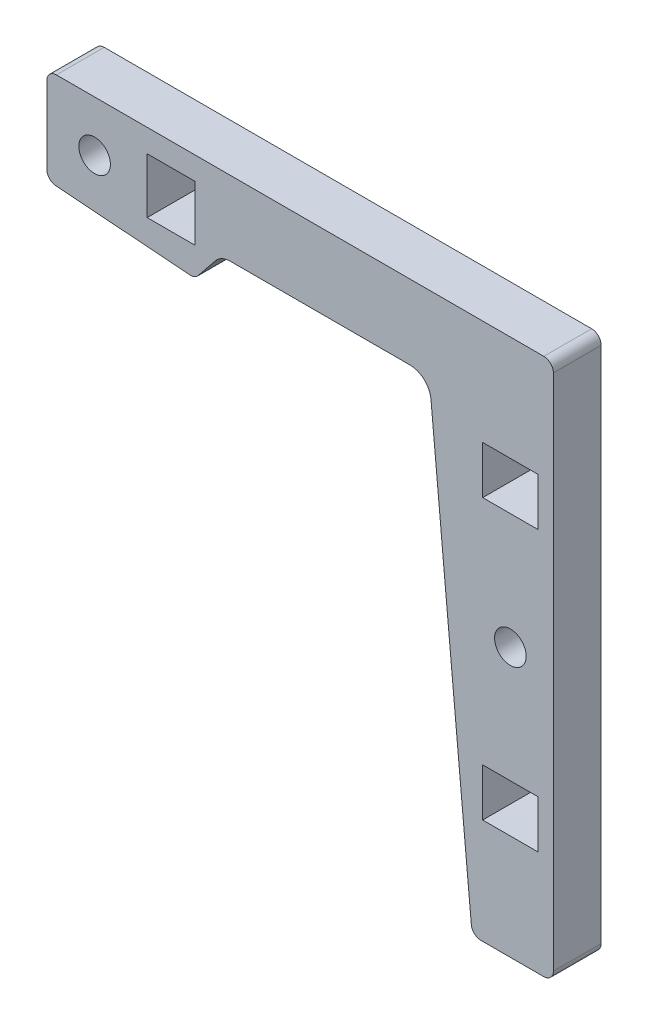
ISO-10303-21;
HEADER;
FILE_DESCRIPTION(('STEP AP214'),'2;1');
FILE_NAME('part.step','',(''),(''),'','','');
FILE_SCHEMA(('AUTOMOTIVE_DESIGN { 1 0 10303 214 1 1 1 1 }'));
ENDSEC;
DATA;
#1=APPLICATION_CONTEXT('core data for automotive mechanical design processes');
#2=APPLICATION_PROTOCOL_DEFINITION('international standard','automotive_design',2000,#1);
#3=PRODUCT_CONTEXT('',#1,'mechanical');
#4=PRODUCT('Part','Part','',(#3));
#5=PRODUCT_RELATED_PRODUCT_CATEGORY('part','',(#4));
#6=PRODUCT_DEFINITION_FORMATION('','',#4);
#7=PRODUCT_DEFINITION_CONTEXT('part definition',#1,'design');
#8=PRODUCT_DEFINITION('design','',#6,#7);
#9=PRODUCT_DEFINITION_SHAPE('','',#8);
#10=(LENGTH_UNIT() NAMED_UNIT(*) SI_UNIT(.MILLI.,.METRE.));
#11=(NAMED_UNIT(*) PLANE_ANGLE_UNIT() SI_UNIT($,.RADIAN.));
#12=(NAMED_UNIT(*) SI_UNIT($,.STERADIAN.) SOLID_ANGLE_UNIT());
#13=UNCERTAINTY_MEASURE_WITH_UNIT(LENGTH_MEASURE(1.E-05),#10,'distance_accuracy_value','');
#14=(GEOMETRIC_REPRESENTATION_CONTEXT(3) GLOBAL_UNCERTAINTY_ASSIGNED_CONTEXT((#13)) GLOBAL_UNIT_ASSIGNED_CONTEXT((#10,
#11,#12)) REPRESENTATION_CONTEXT('',''));
#15=CARTESIAN_POINT('',(0.,0.,0.));
#16=DIRECTION('',(0.,0.,1.));
#17=DIRECTION('',(1.,0.,0.));
#18=AXIS2_PLACEMENT_3D('',#15,#16,#17);
#19=CARTESIAN_POINT('',(699.262,25.6699999680005,79.314999993));
#20=DIRECTION('',(0.,0.,-1.));
#21=DIRECTION('',(-1.,0.,0.));
#22=AXIS2_PLACEMENT_3D('',#19,#20,#21);
#23=PLANE('',#22);
#24=DIRECTION('',(0.,1.,0.));
#25=VECTOR('',#24,1.);
#26=CARTESIAN_POINT('',(740.160750815999,24.13,79.314999993));
#27=LINE('',#26,#25);
#28=CARTESIAN_POINT('',(740.160750815999,17.7799999999999,79.314999993));
#29=VERTEX_POINT('',#28);
#30=CARTESIAN_POINT('',(740.160750815999,24.13,79.314999993));
#31=VERTEX_POINT('',#30);
#32=EDGE_CURVE('E264',#29,#31,#27,.T.);
#33=ORIENTED_EDGE('',*,*,#32,.F.);
#34=DIRECTION('',(1.,0.,0.));
#35=VECTOR('',#34,1.);
#36=CARTESIAN_POINT('',(732.810750783999,17.7799999999999,79.314999993));
#37=LINE('',#36,#35);
#38=CARTESIAN_POINT('',(732.810750783999,17.7799999999999,79.314999993));
#39=VERTEX_POINT('',#38);
#40=EDGE_CURVE('E272',#39,#29,#37,.T.);
#41=ORIENTED_EDGE('',*,*,#40,.F.);
#42=DIRECTION('',(0.,-1.,0.));
#43=VECTOR('',#42,1.);
#44=CARTESIAN_POINT('',(732.810750783999,24.13,79.314999993));
#45=LINE('',#44,#43);
#46=CARTESIAN_POINT('',(732.810750783999,24.13,79.314999993));
#47=VERTEX_POINT('',#46);
#48=EDGE_CURVE('E269',#47,#39,#45,.T.);
#49=ORIENTED_EDGE('',*,*,#48,.F.);
#50=DIRECTION('',(-1.,0.,0.));
#51=VECTOR('',#50,1.);
#52=CARTESIAN_POINT('',(732.810750783999,24.13,79.314999993));
#53=LINE('',#52,#51);
#54=EDGE_CURVE('E266',#31,#47,#53,.T.);
#55=ORIENTED_EDGE('',*,*,#54,.F.);
#56=EDGE_LOOP('',(#33,#41,#49,#55));
#57=FACE_BOUND('',#56,.T.);
#58=CARTESIAN_POINT('',(681.2407508,31.3849999680003,79.314999993));
#59=DIRECTION('',(0.,0.,1.));
#60=DIRECTION('',(1.,0.,0.));
#61=AXIS2_PLACEMENT_3D('',#58,#59,#60);
#62=CIRCLE('',#61,2.099999991);
#63=CARTESIAN_POINT('',(683.340750791,31.3849999680003,79.314999993));
#64=VERTEX_POINT('',#63);
#65=EDGE_CURVE('E332',#64,#64,#62,.T.);
#66=ORIENTED_EDGE('',*,*,#65,.F.);
#67=EDGE_LOOP('',(#66));
#68=FACE_BOUND('',#67,.T.);
#69=DIRECTION('',(1.,0.,0.));
#70=VECTOR('',#69,1.);
#71=CARTESIAN_POINT('',(731.405750799999,-33.2899999679999,79.314999993));
#72=LINE('',#71,#70);
#73=CARTESIAN_POINT('',(732.563295383125,-33.2899999679999,79.314999993));
#74=VERTEX_POINT('',#73);
#75=CARTESIAN_POINT('',(740.930750799999,-33.2899999679999,79.314999993));
#76=VERTEX_POINT('',#75);
#77=EDGE_CURVE('E357',#74,#76,#72,.T.);
#78=ORIENTED_EDGE('',*,*,#77,.T.);
#79=CARTESIAN_POINT('',(740.930750799999,-32.0199999679999,79.314999993));
#80=DIRECTION('',(0.,0.,-1.));
#81=DIRECTION('',(-1.,0.,0.));
#82=AXIS2_PLACEMENT_3D('',#79,#80,#81);
#83=CIRCLE('',#82,1.27);
#84=CARTESIAN_POINT('',(742.200750799999,-32.0199999679999,79.314999993));
#85=VERTEX_POINT('',#84);
#86=EDGE_CURVE('E429',#76,#85,#83,.F.);
#87=ORIENTED_EDGE('',*,*,#86,.T.);
#88=DIRECTION('',(0.,1.,0.));
#89=VECTOR('',#88,1.);
#90=CARTESIAN_POINT('',(742.200750799999,-33.2899999679999,79.314999993));
#91=LINE('',#90,#89);
#92=CARTESIAN_POINT('',(742.200750799999,36.83,79.314999993));
#93=VERTEX_POINT('',#92);
#94=EDGE_CURVE('E360',#85,#93,#91,.T.);
#95=ORIENTED_EDGE('',*,*,#94,.T.);
#96=CARTESIAN_POINT('',(740.930750799999,36.83,79.314999993));
#97=DIRECTION('',(0.,0.,-1.));
#98=DIRECTION('',(-1.,0.,0.));
#99=AXIS2_PLACEMENT_3D('',#96,#97,#98);
#100=CIRCLE('',#99,1.27);
#101=CARTESIAN_POINT('',(740.930750799999,38.1,79.314999993));
#102=VERTEX_POINT('',#101);
#103=EDGE_CURVE('E427',#93,#102,#100,.F.);
#104=ORIENTED_EDGE('',*,*,#103,.T.);
#105=DIRECTION('',(-1.,0.,0.));
#106=VECTOR('',#105,1.);
#107=CARTESIAN_POINT('',(742.200750799999,38.1,79.314999993));
#108=LINE('',#107,#106);
#109=CARTESIAN_POINT('',(676.1607508,38.1,79.314999993));
#110=VERTEX_POINT('',#109);
#111=EDGE_CURVE('E338',#102,#110,#108,.T.);
#112=ORIENTED_EDGE('',*,*,#111,.T.);
#113=CARTESIAN_POINT('',(676.1607508,36.83,79.314999993));
#114=DIRECTION('',(0.,0.,-1.));
#115=DIRECTION('',(-1.,0.,0.));
#116=AXIS2_PLACEMENT_3D('',#113,#114,#115);
#117=CIRCLE('',#116,1.27);
#118=CARTESIAN_POINT('',(674.8907508,36.83,79.314999993));
#119=VERTEX_POINT('',#118);
#120=EDGE_CURVE('E425',#110,#119,#117,.F.);
#121=ORIENTED_EDGE('',*,*,#120,.T.);
#122=DIRECTION('',(0.,-1.,0.));
#123=VECTOR('',#122,1.);
#124=CARTESIAN_POINT('',(674.8907508,38.1,79.314999993));
#125=LINE('',#124,#123);
#126=CARTESIAN_POINT('',(674.8907508,26.5769075709626,79.314999993));
#127=VERTEX_POINT('',#126);
#128=EDGE_CURVE('E341',#119,#127,#125,.T.);
#129=ORIENTED_EDGE('',*,*,#128,.T.);
#130=CARTESIAN_POINT('',(676.1607508,26.5769075709626,79.314999993));
#131=DIRECTION('',(0.,0.,-1.));
#132=DIRECTION('',(-1.,0.,0.));
#133=AXIS2_PLACEMENT_3D('',#130,#131,#132);
#134=CIRCLE('',#133,1.27);
#135=CARTESIAN_POINT('',(676.064256343641,25.3105786958705,79.314999993));
#136=VERTEX_POINT('',#135);
#137=EDGE_CURVE('E421',#127,#136,#134,.F.);
#138=ORIENTED_EDGE('',*,*,#137,.T.);
#139=DIRECTION('',(0.997109350466224,-0.0759798868966348,0.));
#140=VECTOR('',#139,1.);
#141=CARTESIAN_POINT('',(674.8907508,25.4,79.314999993));
#142=LINE('',#141,#140);
#143=CARTESIAN_POINT('',(693.909268652957,23.9507859948022,79.314999993));
#144=VERTEX_POINT('',#143);
#145=EDGE_CURVE('E345',#136,#144,#142,.T.);
#146=ORIENTED_EDGE('',*,*,#145,.T.);
#147=CARTESIAN_POINT('',(694.005763109316,25.2171148698943,79.314999993));
#148=DIRECTION('',(0.,0.,-1.));
#149=DIRECTION('',(-1.,0.,0.));
#150=AXIS2_PLACEMENT_3D('',#147,#148,#149);
#151=CIRCLE('',#150,1.27);
#152=CARTESIAN_POINT('',(694.994953697404,24.4206213166005,79.314999993));
#153=VERTEX_POINT('',#152);
#154=EDGE_CURVE('E57',#144,#153,#151,.F.);
#155=ORIENTED_EDGE('',*,*,#154,.T.);
#156=DIRECTION('',(0.627160278184119,0.77889022684074,0.));
#157=VECTOR('',#156,1.);
#158=CARTESIAN_POINT('',(694.5757508,23.8999999520003,79.314999993));
#159=LINE('',#158,#157);
#160=CARTESIAN_POINT('',(697.283618823825,27.2629870745882,79.314999993));
#161=VERTEX_POINT('',#160);
#162=EDGE_CURVE('E347',#153,#161,#159,.T.);
#163=ORIENTED_EDGE('',*,*,#162,.T.);
#164=CARTESIAN_POINT('',(699.262,25.6699999680005,79.314999993));
#165=DIRECTION('',(0.,0.,-1.));
#166=DIRECTION('',(-1.,0.,0.));
#167=AXIS2_PLACEMENT_3D('',#164,#165,#166);
#168=CIRCLE('',#167,2.53999999999999);
#169=CARTESIAN_POINT('',(699.262,28.2099999680004,79.314999993));
#170=VERTEX_POINT('',#169);
#171=EDGE_CURVE('E349',#161,#170,#168,.T.);
#172=ORIENTED_EDGE('',*,*,#171,.T.);
#173=DIRECTION('',(1.,0.,0.));
#174=VECTOR('',#173,1.);
#175=CARTESIAN_POINT('',(699.262,28.2099999680005,79.314999993));
#176=LINE('',#175,#174);
#177=CARTESIAN_POINT('',(723.138,28.2099999680005,79.314999993));
#178=VERTEX_POINT('',#177);
#179=EDGE_CURVE('E351',#170,#178,#176,.T.);
#180=ORIENTED_EDGE('',*,*,#179,.T.);
#181=CARTESIAN_POINT('',(723.138,25.4039824240846,79.314999993));
#182=DIRECTION('',(0.,0.,-1.));
#183=DIRECTION('',(1.,0.,0.));
#184=AXIS2_PLACEMENT_3D('',#181,#182,#183);
#185=CIRCLE('',#184,2.80601754391578);
#186=CARTESIAN_POINT('',(725.932,25.6634018851243,79.314999993));
#187=VERTEX_POINT('',#186);
#188=EDGE_CURVE('E353',#178,#187,#185,.T.);
#189=ORIENTED_EDGE('',*,*,#188,.T.);
#190=DIRECTION('',(0.0924511187045921,-0.995717224241034,0.));
#191=VECTOR('',#190,1.);
#192=CARTESIAN_POINT('',(725.932,25.6634018851243,79.314999993));
#193=LINE('',#192,#191);
#194=CARTESIAN_POINT('',(731.298734508339,-32.1374128887547,79.314999993));
#195=VERTEX_POINT('',#194);
#196=EDGE_CURVE('E355',#187,#195,#193,.T.);
#197=ORIENTED_EDGE('',*,*,#196,.T.);
#198=CARTESIAN_POINT('',(732.563295383125,-32.0199999679999,79.314999993));
#199=DIRECTION('',(0.,0.,-1.));
#200=DIRECTION('',(-1.,0.,0.));
#201=AXIS2_PLACEMENT_3D('',#198,#199,#200);
#202=CIRCLE('',#201,1.27);
#203=EDGE_CURVE('E423',#195,#74,#202,.F.);
#204=ORIENTED_EDGE('',*,*,#203,.T.);
#205=EDGE_LOOP('',(#78,#87,#95,#104,#112,#121,#129,#138,#146,#155,#163,#172,#180,#189,#197,#204));
#206=FACE_BOUND('',#205,.T.);
#207=DIRECTION('',(0.,1.,0.));
#208=VECTOR('',#207,1.);
#209=CARTESIAN_POINT('',(694.5757508,35.0599999840003,79.314999993));
#210=LINE('',#209,#208);
#211=CARTESIAN_POINT('',(694.5757508,27.7099999520003,79.314999993));
#212=VERTEX_POINT('',#211);
#213=CARTESIAN_POINT('',(694.5757508,35.0599999840003,79.314999993));
#214=VERTEX_POINT('',#213);
#215=EDGE_CURVE('E301',#212,#214,#210,.T.);
#216=ORIENTED_EDGE('',*,*,#215,.F.);
#217=DIRECTION('',(1.,0.,0.));
#218=VECTOR('',#217,1.);
#219=CARTESIAN_POINT('',(688.2257508,27.7099999520003,79.314999993));
#220=LINE('',#219,#218);
#221=CARTESIAN_POINT('',(688.2257508,27.7099999520003,79.314999993));
#222=VERTEX_POINT('',#221);
#223=EDGE_CURVE('E309',#222,#212,#220,.T.);
#224=ORIENTED_EDGE('',*,*,#223,.F.);
#225=DIRECTION('',(0.,-1.,0.));
#226=VECTOR('',#225,1.);
#227=CARTESIAN_POINT('',(688.2257508,35.0599999840003,79.314999993));
#228=LINE('',#227,#226);
#229=CARTESIAN_POINT('',(688.2257508,35.0599999840003,79.314999993));
#230=VERTEX_POINT('',#229);
#231=EDGE_CURVE('E306',#230,#222,#228,.T.);
#232=ORIENTED_EDGE('',*,*,#231,.F.);
#233=DIRECTION('',(-1.,0.,0.));
#234=VECTOR('',#233,1.);
#235=CARTESIAN_POINT('',(688.2257508,35.0599999840003,79.314999993));
#236=LINE('',#235,#234);
#237=EDGE_CURVE('E303',#214,#230,#236,.T.);
#238=ORIENTED_EDGE('',*,*,#237,.F.);
#239=EDGE_LOOP('',(#216,#224,#232,#238));
#240=FACE_BOUND('',#239,.T.);
#241=CARTESIAN_POINT('',(736.485750799999,2.40500001600005,79.314999993));
#242=DIRECTION('',(0.,0.,1.));
#243=DIRECTION('',(1.,0.,0.));
#244=AXIS2_PLACEMENT_3D('',#241,#242,#243);
#245=CIRCLE('',#244,2.099999991);
#246=CARTESIAN_POINT('',(738.585750790999,2.40500001600005,79.314999993));
#247=VERTEX_POINT('',#246);
#248=EDGE_CURVE('E295',#247,#247,#245,.T.);
#249=ORIENTED_EDGE('',*,*,#248,.F.);
#250=EDGE_LOOP('',(#249));
#251=FACE_BOUND('',#250,.T.);
#252=DIRECTION('',(0.,1.,0.));
#253=VECTOR('',#252,1.);
#254=CARTESIAN_POINT('',(740.160750815999,-12.9699999679998,79.314999993));
#255=LINE('',#254,#253);
#256=CARTESIAN_POINT('',(740.160750815999,-19.3199999679998,79.314999993));
#257=VERTEX_POINT('',#256);
#258=CARTESIAN_POINT('',(740.160750815999,-12.9699999679998,79.314999993));
#259=VERTEX_POINT('',#258);
#260=EDGE_CURVE('E223',#257,#259,#255,.T.);
#261=ORIENTED_EDGE('',*,*,#260,.F.);
#262=DIRECTION('',(1.,0.,0.));
#263=VECTOR('',#262,1.);
#264=CARTESIAN_POINT('',(732.810750783999,-19.3199999679998,79.314999993));
#265=LINE('',#264,#263);
#266=CARTESIAN_POINT('',(732.810750783999,-19.3199999679998,79.314999993));
#267=VERTEX_POINT('',#266);
#268=EDGE_CURVE('E248',#267,#257,#265,.T.);
#269=ORIENTED_EDGE('',*,*,#268,.F.);
#270=DIRECTION('',(0.,-1.,0.));
#271=VECTOR('',#270,1.);
#272=CARTESIAN_POINT('',(732.810750783999,-12.9699999679998,79.314999993));
#273=LINE('',#272,#271);
#274=CARTESIAN_POINT('',(732.810750783999,-12.9699999679998,79.314999993));
#275=VERTEX_POINT('',#274);
#276=EDGE_CURVE('E246',#275,#267,#273,.T.);
#277=ORIENTED_EDGE('',*,*,#276,.F.);
#278=DIRECTION('',(-1.,0.,0.));
#279=VECTOR('',#278,1.);
#280=CARTESIAN_POINT('',(732.810750783999,-12.9699999679998,79.314999993));
#281=LINE('',#280,#279);
#282=EDGE_CURVE('E233',#259,#275,#281,.T.);
#283=ORIENTED_EDGE('',*,*,#282,.F.);
#284=EDGE_LOOP('',(#261,#269,#277,#283));
#285=FACE_BOUND('',#284,.T.);
#286=ADVANCED_FACE('F34',(#57,#68,#206,#240,#251,#285),#23,.F.);
#287=CARTESIAN_POINT('',(699.262,25.6699999680005,72.964999993));
#288=DIRECTION('',(0.,0.,-1.));
#289=DIRECTION('',(-1.,0.,0.));
#290=AXIS2_PLACEMENT_3D('',#287,#288,#289);
#291=PLANE('',#290);
#292=DIRECTION('',(1.,0.,0.));
#293=VECTOR('',#292,1.);
#294=CARTESIAN_POINT('',(688.2257508,27.7099999520003,72.964999993));
#295=LINE('',#294,#293);
#296=CARTESIAN_POINT('',(688.2257508,27.7099999520003,72.964999993));
#297=VERTEX_POINT('',#296);
#298=CARTESIAN_POINT('',(694.5757508,27.7099999520003,72.964999993));
#299=VERTEX_POINT('',#298);
#300=EDGE_CURVE('E304',#297,#299,#295,.T.);
#301=ORIENTED_EDGE('',*,*,#300,.T.);
#302=DIRECTION('',(0.,1.,0.));
#303=VECTOR('',#302,1.);
#304=CARTESIAN_POINT('',(694.5757508,35.0599999840003,72.964999993));
#305=LINE('',#304,#303);
#306=CARTESIAN_POINT('',(694.5757508,35.0599999840003,72.964999993));
#307=VERTEX_POINT('',#306);
#308=EDGE_CURVE('E298',#299,#307,#305,.T.);
#309=ORIENTED_EDGE('',*,*,#308,.T.);
#310=DIRECTION('',(-1.,0.,0.));
#311=VECTOR('',#310,1.);
#312=CARTESIAN_POINT('',(688.2257508,35.0599999840003,72.964999993));
#313=LINE('',#312,#311);
#314=CARTESIAN_POINT('',(688.2257508,35.0599999840003,72.964999993));
#315=VERTEX_POINT('',#314);
#316=EDGE_CURVE('E314',#307,#315,#313,.T.);
#317=ORIENTED_EDGE('',*,*,#316,.T.);
#318=DIRECTION('',(0.,-1.,0.));
#319=VECTOR('',#318,1.);
#320=CARTESIAN_POINT('',(688.2257508,35.0599999840003,72.964999993));
#321=LINE('',#320,#319);
#322=EDGE_CURVE('E317',#315,#297,#321,.T.);
#323=ORIENTED_EDGE('',*,*,#322,.T.);
#324=EDGE_LOOP('',(#301,#309,#317,#323));
#325=FACE_BOUND('',#324,.T.);
#326=CARTESIAN_POINT('',(681.2407508,31.3849999680003,72.964999993));
#327=DIRECTION('',(0.,0.,1.));
#328=DIRECTION('',(1.,0.,0.));
#329=AXIS2_PLACEMENT_3D('',#326,#327,#328);
#330=CIRCLE('',#329,2.099999991);
#331=CARTESIAN_POINT('',(683.340750791,31.3849999680003,72.964999993));
#332=VERTEX_POINT('',#331);
#333=EDGE_CURVE('E331',#332,#332,#330,.T.);
#334=ORIENTED_EDGE('',*,*,#333,.T.);
#335=EDGE_LOOP('',(#334));
#336=FACE_BOUND('',#335,.T.);
#337=DIRECTION('',(0.,1.,0.));
#338=VECTOR('',#337,1.);
#339=CARTESIAN_POINT('',(742.200750799999,-33.2899999679999,72.964999993));
#340=LINE('',#339,#338);
#341=CARTESIAN_POINT('',(742.200750799999,-32.0199999679999,72.964999993));
#342=VERTEX_POINT('',#341);
#343=CARTESIAN_POINT('',(742.200750799999,36.83,72.964999993));
#344=VERTEX_POINT('',#343);
#345=EDGE_CURVE('E342',#342,#344,#340,.T.);
#346=ORIENTED_EDGE('',*,*,#345,.F.);
#347=CARTESIAN_POINT('',(740.930750799999,-32.0199999679999,72.964999993));
#348=DIRECTION('',(0.,0.,-1.));
#349=DIRECTION('',(-1.,0.,0.));
#350=AXIS2_PLACEMENT_3D('',#347,#348,#349);
#351=CIRCLE('',#350,1.27);
#352=CARTESIAN_POINT('',(740.930750799999,-33.2899999679999,72.964999993));
#353=VERTEX_POINT('',#352);
#354=EDGE_CURVE('E413',#342,#353,#351,.T.);
#355=ORIENTED_EDGE('',*,*,#354,.T.);
#356=DIRECTION('',(1.,0.,0.));
#357=VECTOR('',#356,1.);
#358=CARTESIAN_POINT('',(731.405750799999,-33.2899999679999,72.964999993));
#359=LINE('',#358,#357);
#360=CARTESIAN_POINT('',(732.563295383125,-33.2899999679999,72.964999993));
#361=VERTEX_POINT('',#360);
#362=EDGE_CURVE('E382',#361,#353,#359,.T.);
#363=ORIENTED_EDGE('',*,*,#362,.F.);
#364=CARTESIAN_POINT('',(732.563295383125,-32.0199999679999,72.964999993));
#365=DIRECTION('',(0.,0.,-1.));
#366=DIRECTION('',(-1.,0.,0.));
#367=AXIS2_PLACEMENT_3D('',#364,#365,#366);
#368=CIRCLE('',#367,1.27);
#369=CARTESIAN_POINT('',(731.298734508339,-32.1374128887547,72.964999993));
#370=VERTEX_POINT('',#369);
#371=EDGE_CURVE('E407',#361,#370,#368,.T.);
#372=ORIENTED_EDGE('',*,*,#371,.T.);
#373=DIRECTION('',(0.0924511187045921,-0.995717224241034,0.));
#374=VECTOR('',#373,1.);
#375=CARTESIAN_POINT('',(725.932,25.6634018851243,72.964999993));
#376=LINE('',#375,#374);
#377=CARTESIAN_POINT('',(725.932,25.6634018851243,72.964999993));
#378=VERTEX_POINT('',#377);
#379=EDGE_CURVE('E380',#378,#370,#376,.T.);
#380=ORIENTED_EDGE('',*,*,#379,.F.);
#381=CARTESIAN_POINT('',(723.138,25.4039824240846,72.964999993));
#382=DIRECTION('',(0.,0.,-1.));
#383=DIRECTION('',(1.,0.,0.));
#384=AXIS2_PLACEMENT_3D('',#381,#382,#383);
#385=CIRCLE('',#384,2.80601754391578);
#386=CARTESIAN_POINT('',(723.138,28.2099999680005,72.964999993));
#387=VERTEX_POINT('',#386);
#388=EDGE_CURVE('E378',#387,#378,#385,.T.);
#389=ORIENTED_EDGE('',*,*,#388,.F.);
#390=DIRECTION('',(1.,0.,0.));
#391=VECTOR('',#390,1.);
#392=CARTESIAN_POINT('',(699.262,28.2099999680005,72.964999993));
#393=LINE('',#392,#391);
#394=CARTESIAN_POINT('',(699.262,28.2099999680004,72.964999993));
#395=VERTEX_POINT('',#394);
#396=EDGE_CURVE('E376',#395,#387,#393,.T.);
#397=ORIENTED_EDGE('',*,*,#396,.F.);
#398=CARTESIAN_POINT('',(699.262,25.6699999680005,72.964999993));
#399=DIRECTION('',(0.,0.,-1.));
#400=DIRECTION('',(-1.,0.,0.));
#401=AXIS2_PLACEMENT_3D('',#398,#399,#400);
#402=CIRCLE('',#401,2.53999999999999);
#403=CARTESIAN_POINT('',(697.283618823825,27.2629870745882,72.964999993));
#404=VERTEX_POINT('',#403);
#405=EDGE_CURVE('E374',#404,#395,#402,.T.);
#406=ORIENTED_EDGE('',*,*,#405,.F.);
#407=DIRECTION('',(0.627160278184119,0.77889022684074,0.));
#408=VECTOR('',#407,1.);
#409=CARTESIAN_POINT('',(694.5757508,23.8999999520003,72.964999993));
#410=LINE('',#409,#408);
#411=CARTESIAN_POINT('',(694.994953697404,24.4206213166005,72.964999993));
#412=VERTEX_POINT('',#411);
#413=EDGE_CURVE('E372',#412,#404,#410,.T.);
#414=ORIENTED_EDGE('',*,*,#413,.F.);
#415=CARTESIAN_POINT('',(694.005763109316,25.2171148698943,72.964999993));
#416=DIRECTION('',(0.,0.,-1.));
#417=DIRECTION('',(-1.,0.,0.));
#418=AXIS2_PLACEMENT_3D('',#415,#416,#417);
#419=CIRCLE('',#418,1.27);
#420=CARTESIAN_POINT('',(693.909268652957,23.9507859948022,72.964999993));
#421=VERTEX_POINT('',#420);
#422=EDGE_CURVE('E403',#412,#421,#419,.T.);
#423=ORIENTED_EDGE('',*,*,#422,.T.);
#424=DIRECTION('',(0.997109350466224,-0.0759798868966348,0.));
#425=VECTOR('',#424,1.);
#426=CARTESIAN_POINT('',(674.8907508,25.4,72.964999993));
#427=LINE('',#426,#425);
#428=CARTESIAN_POINT('',(676.064256343641,25.3105786958705,72.964999993));
#429=VERTEX_POINT('',#428);
#430=EDGE_CURVE('E369',#429,#421,#427,.T.);
#431=ORIENTED_EDGE('',*,*,#430,.F.);
#432=CARTESIAN_POINT('',(676.1607508,26.5769075709626,72.964999993));
#433=DIRECTION('',(0.,0.,-1.));
#434=DIRECTION('',(-1.,0.,0.));
#435=AXIS2_PLACEMENT_3D('',#432,#433,#434);
#436=CIRCLE('',#435,1.27);
#437=CARTESIAN_POINT('',(674.8907508,26.5769075709626,72.964999993));
#438=VERTEX_POINT('',#437);
#439=EDGE_CURVE('E405',#429,#438,#436,.T.);
#440=ORIENTED_EDGE('',*,*,#439,.T.);
#441=DIRECTION('',(0.,-1.,0.));
#442=VECTOR('',#441,1.);
#443=CARTESIAN_POINT('',(674.8907508,38.1,72.964999993));
#444=LINE('',#443,#442);
#445=CARTESIAN_POINT('',(674.8907508,36.83,72.964999993));
#446=VERTEX_POINT('',#445);
#447=EDGE_CURVE('E366',#446,#438,#444,.T.);
#448=ORIENTED_EDGE('',*,*,#447,.F.);
#449=CARTESIAN_POINT('',(676.1607508,36.83,72.964999993));
#450=DIRECTION('',(0.,0.,-1.));
#451=DIRECTION('',(-1.,0.,0.));
#452=AXIS2_PLACEMENT_3D('',#449,#450,#451);
#453=CIRCLE('',#452,1.27);
#454=CARTESIAN_POINT('',(676.1607508,38.1,72.964999993));
#455=VERTEX_POINT('',#454);
#456=EDGE_CURVE('E409',#446,#455,#453,.T.);
#457=ORIENTED_EDGE('',*,*,#456,.T.);
#458=DIRECTION('',(-1.,0.,0.));
#459=VECTOR('',#458,1.);
#460=CARTESIAN_POINT('',(742.200750799999,38.1,72.964999993));
#461=LINE('',#460,#459);
#462=CARTESIAN_POINT('',(740.930750799999,38.1,72.964999993));
#463=VERTEX_POINT('',#462);
#464=EDGE_CURVE('E335',#463,#455,#461,.T.);
#465=ORIENTED_EDGE('',*,*,#464,.F.);
#466=CARTESIAN_POINT('',(740.930750799999,36.83,72.964999993));
#467=DIRECTION('',(0.,0.,-1.));
#468=DIRECTION('',(-1.,0.,0.));
#469=AXIS2_PLACEMENT_3D('',#466,#467,#468);
#470=CIRCLE('',#469,1.27);
#471=EDGE_CURVE('E411',#463,#344,#470,.T.);
#472=ORIENTED_EDGE('',*,*,#471,.T.);
#473=EDGE_LOOP('',(#346,#355,#363,#372,#380,#389,#397,#406,#414,#423,#431,#440,#448,#457,#465,#472));
#474=FACE_BOUND('',#473,.T.);
#475=CARTESIAN_POINT('',(736.485750799999,2.40500001600005,72.964999993));
#476=DIRECTION('',(0.,0.,1.));
#477=DIRECTION('',(1.,0.,0.));
#478=AXIS2_PLACEMENT_3D('',#475,#476,#477);
#479=CIRCLE('',#478,2.099999991);
#480=CARTESIAN_POINT('',(738.585750790999,2.40500001600005,72.964999993));
#481=VERTEX_POINT('',#480);
#482=EDGE_CURVE('E294',#481,#481,#479,.T.);
#483=ORIENTED_EDGE('',*,*,#482,.T.);
#484=EDGE_LOOP('',(#483));
#485=FACE_BOUND('',#484,.T.);
#486=DIRECTION('',(1.,0.,0.));
#487=VECTOR('',#486,1.);
#488=CARTESIAN_POINT('',(732.810750783999,17.7799999999999,72.964999993));
#489=LINE('',#488,#487);
#490=CARTESIAN_POINT('',(732.810750783999,17.7799999999999,72.964999993));
#491=VERTEX_POINT('',#490);
#492=CARTESIAN_POINT('',(740.160750815999,17.7799999999999,72.964999993));
#493=VERTEX_POINT('',#492);
#494=EDGE_CURVE('E267',#491,#493,#489,.T.);
#495=ORIENTED_EDGE('',*,*,#494,.T.);
#496=DIRECTION('',(0.,1.,0.));
#497=VECTOR('',#496,1.);
#498=CARTESIAN_POINT('',(740.160750815999,24.13,72.964999993));
#499=LINE('',#498,#497);
#500=CARTESIAN_POINT('',(740.160750815999,24.13,72.964999993));
#501=VERTEX_POINT('',#500);
#502=EDGE_CURVE('E241',#493,#501,#499,.T.);
#503=ORIENTED_EDGE('',*,*,#502,.T.);
#504=DIRECTION('',(-1.,0.,0.));
#505=VECTOR('',#504,1.);
#506=CARTESIAN_POINT('',(732.810750783999,24.13,72.964999993));
#507=LINE('',#506,#505);
#508=CARTESIAN_POINT('',(732.810750783999,24.13,72.964999993));
#509=VERTEX_POINT('',#508);
#510=EDGE_CURVE('E277',#501,#509,#507,.T.);
#511=ORIENTED_EDGE('',*,*,#510,.T.);
#512=DIRECTION('',(0.,-1.,0.));
#513=VECTOR('',#512,1.);
#514=CARTESIAN_POINT('',(732.810750783999,24.13,72.964999993));
#515=LINE('',#514,#513);
#516=EDGE_CURVE('E280',#509,#491,#515,.T.);
#517=ORIENTED_EDGE('',*,*,#516,.T.);
#518=EDGE_LOOP('',(#495,#503,#511,#517));
#519=FACE_BOUND('',#518,.T.);
#520=DIRECTION('',(1.,0.,0.));
#521=VECTOR('',#520,1.);
#522=CARTESIAN_POINT('',(732.810750783999,-19.3199999679998,72.964999993));
#523=LINE('',#522,#521);
#524=CARTESIAN_POINT('',(732.810750783999,-19.3199999679998,72.964999993));
#525=VERTEX_POINT('',#524);
#526=CARTESIAN_POINT('',(740.160750815999,-19.3199999679998,72.964999993));
#527=VERTEX_POINT('',#526);
#528=EDGE_CURVE('E234',#525,#527,#523,.T.);
#529=ORIENTED_EDGE('',*,*,#528,.T.);
#530=DIRECTION('',(0.,1.,0.));
#531=VECTOR('',#530,1.);
#532=CARTESIAN_POINT('',(740.160750815999,-12.9699999679998,72.964999993));
#533=LINE('',#532,#531);
#534=CARTESIAN_POINT('',(740.160750815999,-12.9699999679998,72.964999993));
#535=VERTEX_POINT('',#534);
#536=EDGE_CURVE('E252',#527,#535,#533,.T.);
#537=ORIENTED_EDGE('',*,*,#536,.T.);
#538=DIRECTION('',(-1.,0.,0.));
#539=VECTOR('',#538,1.);
#540=CARTESIAN_POINT('',(732.810750783999,-12.9699999679998,72.964999993));
#541=LINE('',#540,#539);
#542=CARTESIAN_POINT('',(732.810750783999,-12.9699999679998,72.964999993));
#543=VERTEX_POINT('',#542);
#544=EDGE_CURVE('E240',#535,#543,#541,.T.);
#545=ORIENTED_EDGE('',*,*,#544,.T.);
#546=DIRECTION('',(0.,-1.,0.));
#547=VECTOR('',#546,1.);
#548=CARTESIAN_POINT('',(732.810750783999,-12.9699999679998,72.964999993));
#549=LINE('',#548,#547);
#550=EDGE_CURVE('E255',#543,#525,#549,.T.);
#551=ORIENTED_EDGE('',*,*,#550,.T.);
#552=EDGE_LOOP('',(#529,#537,#545,#551));
#553=FACE_BOUND('',#552,.T.);
#554=ADVANCED_FACE('F454',(#325,#336,#474,#485,#519,#553),#291,.T.);
#555=CARTESIAN_POINT('',(742.200750799999,38.1,79.314999993));
#556=DIRECTION('',(0.,-1.,0.));
#557=DIRECTION('',(1.,0.,0.));
#558=AXIS2_PLACEMENT_3D('',#555,#556,#557);
#559=PLANE('',#558);
#560=ORIENTED_EDGE('',*,*,#111,.F.);
#561=DIRECTION('',(0.,0.,-1.));
#562=VECTOR('',#561,1.);
#563=CARTESIAN_POINT('',(740.930750799999,38.1,79.314999993));
#564=LINE('',#563,#562);
#565=EDGE_CURVE('E433',#102,#463,#564,.T.);
#566=ORIENTED_EDGE('',*,*,#565,.T.);
#567=ORIENTED_EDGE('',*,*,#464,.T.);
#568=DIRECTION('',(0.,0.,-1.));
#569=VECTOR('',#568,1.);
#570=CARTESIAN_POINT('',(676.1607508,38.1,79.314999993));
#571=LINE('',#570,#569);
#572=EDGE_CURVE('E431',#455,#110,#571,.F.);
#573=ORIENTED_EDGE('',*,*,#572,.T.);
#574=EDGE_LOOP('',(#560,#566,#567,#573));
#575=FACE_BOUND('',#574,.T.);
#576=ADVANCED_FACE('F504',(#575),#559,.F.);
#577=CARTESIAN_POINT('',(674.8907508,38.1,79.314999993));
#578=DIRECTION('',(1.,0.,0.));
#579=DIRECTION('',(0.,0.,-1.));
#580=AXIS2_PLACEMENT_3D('',#577,#578,#579);
#581=PLANE('',#580);
#582=ORIENTED_EDGE('',*,*,#128,.F.);
#583=DIRECTION('',(0.,0.,-1.));
#584=VECTOR('',#583,1.);
#585=CARTESIAN_POINT('',(674.8907508,36.83,79.314999993));
#586=LINE('',#585,#584);
#587=EDGE_CURVE('E438',#119,#446,#586,.T.);
#588=ORIENTED_EDGE('',*,*,#587,.T.);
#589=ORIENTED_EDGE('',*,*,#447,.T.);
#590=DIRECTION('',(0.,0.,-1.));
#591=VECTOR('',#590,1.);
#592=CARTESIAN_POINT('',(674.8907508,26.5769075709626,79.314999993));
#593=LINE('',#592,#591);
#594=EDGE_CURVE('E436',#438,#127,#593,.F.);
#595=ORIENTED_EDGE('',*,*,#594,.T.);
#596=EDGE_LOOP('',(#582,#588,#589,#595));
#597=FACE_BOUND('',#596,.T.);
#598=ADVANCED_FACE('F512',(#597),#581,.F.);
#599=CARTESIAN_POINT('',(674.8907508,25.4,79.314999993));
#600=DIRECTION('',(0.0759798868966348,0.997109350466224,0.));
#601=DIRECTION('',(-0.997109350466224,0.0759798868966348,0.));
#602=AXIS2_PLACEMENT_3D('',#599,#600,#601);
#603=PLANE('',#602);
#604=ORIENTED_EDGE('',*,*,#145,.F.);
#605=DIRECTION('',(0.,0.,-1.));
#606=VECTOR('',#605,1.);
#607=CARTESIAN_POINT('',(676.064256343641,25.3105786958705,79.314999993));
#608=LINE('',#607,#606);
#609=EDGE_CURVE('E42',#136,#429,#608,.T.);
#610=ORIENTED_EDGE('',*,*,#609,.T.);
#611=ORIENTED_EDGE('',*,*,#430,.T.);
#612=DIRECTION('',(0.,0.,-1.));
#613=VECTOR('',#612,1.);
#614=CARTESIAN_POINT('',(693.909268652957,23.9507859948022,79.314999993));
#615=LINE('',#614,#613);
#616=EDGE_CURVE('E442',#421,#144,#615,.F.);
#617=ORIENTED_EDGE('',*,*,#616,.T.);
#618=EDGE_LOOP('',(#604,#610,#611,#617));
#619=FACE_BOUND('',#618,.T.);
#620=ADVANCED_FACE('F448',(#619),#603,.F.);
#621=CARTESIAN_POINT('',(694.5757508,23.8999999520003,79.314999993));
#622=DIRECTION('',(-0.77889022684074,0.627160278184119,0.));
#623=DIRECTION('',(-0.627160278184119,-0.77889022684074,0.));
#624=AXIS2_PLACEMENT_3D('',#621,#622,#623);
#625=PLANE('',#624);
#626=ORIENTED_EDGE('',*,*,#162,.F.);
#627=DIRECTION('',(0.,0.,-1.));
#628=VECTOR('',#627,1.);
#629=CARTESIAN_POINT('',(694.994953697404,24.4206213166005,79.314999993));
#630=LINE('',#629,#628);
#631=EDGE_CURVE('E11',#153,#412,#630,.T.);
#632=ORIENTED_EDGE('',*,*,#631,.T.);
#633=ORIENTED_EDGE('',*,*,#413,.T.);
#634=DIRECTION('',(0.,0.,-1.));
#635=VECTOR('',#634,1.);
#636=CARTESIAN_POINT('',(697.283618823825,27.2629870745882,79.314999993));
#637=LINE('',#636,#635);
#638=EDGE_CURVE('E395',#161,#404,#637,.T.);
#639=ORIENTED_EDGE('',*,*,#638,.F.);
#640=EDGE_LOOP('',(#626,#632,#633,#639));
#641=FACE_BOUND('',#640,.T.);
#642=ADVANCED_FACE('F462',(#641),#625,.F.);
#643=CARTESIAN_POINT('',(699.262,25.6699999680005,79.314999993));
#644=DIRECTION('',(0.,0.,-1.));
#645=DIRECTION('',(-1.,0.,0.));
#646=AXIS2_PLACEMENT_3D('',#643,#644,#645);
#647=CYLINDRICAL_SURFACE('',#646,2.53999999999999);
#648=ORIENTED_EDGE('',*,*,#405,.T.);
#649=DIRECTION('',(0.,0.,-1.));
#650=VECTOR('',#649,1.);
#651=CARTESIAN_POINT('',(699.262,28.2099999680004,79.314999993));
#652=LINE('',#651,#650);
#653=EDGE_CURVE('E392',#170,#395,#652,.T.);
#654=ORIENTED_EDGE('',*,*,#653,.F.);
#655=ORIENTED_EDGE('',*,*,#171,.F.);
#656=ORIENTED_EDGE('',*,*,#638,.T.);
#657=EDGE_LOOP('',(#648,#654,#655,#656));
#658=FACE_BOUND('',#657,.T.);
#659=ADVANCED_FACE('F470',(#658),#647,.F.);
#660=CARTESIAN_POINT('',(699.262,28.2099999680005,79.314999993));
#661=DIRECTION('',(0.,1.,0.));
#662=DIRECTION('',(-1.,0.,0.));
#663=AXIS2_PLACEMENT_3D('',#660,#661,#662);
#664=PLANE('',#663);
#665=ORIENTED_EDGE('',*,*,#396,.T.);
#666=DIRECTION('',(0.,0.,-1.));
#667=VECTOR('',#666,1.);
#668=CARTESIAN_POINT('',(723.138,28.2099999680005,79.314999993));
#669=LINE('',#668,#667);
#670=EDGE_CURVE('E389',#178,#387,#669,.T.);
#671=ORIENTED_EDGE('',*,*,#670,.F.);
#672=ORIENTED_EDGE('',*,*,#179,.F.);
#673=ORIENTED_EDGE('',*,*,#653,.T.);
#674=EDGE_LOOP('',(#665,#671,#672,#673));
#675=FACE_BOUND('',#674,.T.);
#676=ADVANCED_FACE('F473',(#675),#664,.F.);
#677=CARTESIAN_POINT('',(723.138,25.4039824240846,79.314999993));
#678=DIRECTION('',(0.,0.,-1.));
#679=DIRECTION('',(-1.,0.,0.));
#680=AXIS2_PLACEMENT_3D('',#677,#678,#679);
#681=CYLINDRICAL_SURFACE('',#680,2.80601754391578);
#682=ORIENTED_EDGE('',*,*,#388,.T.);
#683=DIRECTION('',(0.,0.,-1.));
#684=VECTOR('',#683,1.);
#685=CARTESIAN_POINT('',(725.932,25.6634018851243,79.314999993));
#686=LINE('',#685,#684);
#687=EDGE_CURVE('E363',#187,#378,#686,.T.);
#688=ORIENTED_EDGE('',*,*,#687,.F.);
#689=ORIENTED_EDGE('',*,*,#188,.F.);
#690=ORIENTED_EDGE('',*,*,#670,.T.);
#691=EDGE_LOOP('',(#682,#688,#689,#690));
#692=FACE_BOUND('',#691,.T.);
#693=ADVANCED_FACE('F478',(#692),#681,.F.);
#694=CARTESIAN_POINT('',(725.932,25.6634018851243,79.314999993));
#695=DIRECTION('',(0.995717224241034,0.0924511187045921,0.));
#696=DIRECTION('',(-0.0924511187045921,0.995717224241034,0.));
#697=AXIS2_PLACEMENT_3D('',#694,#695,#696);
#698=PLANE('',#697);
#699=ORIENTED_EDGE('',*,*,#379,.T.);
#700=DIRECTION('',(0.,0.,-1.));
#701=VECTOR('',#700,1.);
#702=CARTESIAN_POINT('',(731.298734508339,-32.1374128887547,79.314999993));
#703=LINE('',#702,#701);
#704=EDGE_CURVE('E49',#370,#195,#703,.F.);
#705=ORIENTED_EDGE('',*,*,#704,.T.);
#706=ORIENTED_EDGE('',*,*,#196,.F.);
#707=ORIENTED_EDGE('',*,*,#687,.T.);
#708=EDGE_LOOP('',(#699,#705,#706,#707));
#709=FACE_BOUND('',#708,.T.);
#710=ADVANCED_FACE('F539',(#709),#698,.F.);
#711=CARTESIAN_POINT('',(731.405750799999,-33.2899999679999,79.314999993));
#712=DIRECTION('',(0.,1.,0.));
#713=DIRECTION('',(0.,0.,1.));
#714=AXIS2_PLACEMENT_3D('',#711,#712,#713);
#715=PLANE('',#714);
#716=ORIENTED_EDGE('',*,*,#362,.T.);
#717=DIRECTION('',(0.,0.,-1.));
#718=VECTOR('',#717,1.);
#719=CARTESIAN_POINT('',(740.930750799999,-33.2899999679999,79.314999993));
#720=LINE('',#719,#718);
#721=EDGE_CURVE('E418',#353,#76,#720,.F.);
#722=ORIENTED_EDGE('',*,*,#721,.T.);
#723=ORIENTED_EDGE('',*,*,#77,.F.);
#724=DIRECTION('',(0.,0.,-1.));
#725=VECTOR('',#724,1.);
#726=CARTESIAN_POINT('',(732.563295383125,-33.2899999679999,79.314999993));
#727=LINE('',#726,#725);
#728=EDGE_CURVE('E415',#74,#361,#727,.T.);
#729=ORIENTED_EDGE('',*,*,#728,.T.);
#730=EDGE_LOOP('',(#716,#722,#723,#729));
#731=FACE_BOUND('',#730,.T.);
#732=ADVANCED_FACE('F486',(#731),#715,.F.);
#733=CARTESIAN_POINT('',(742.200750799999,-33.2899999679999,79.314999993));
#734=DIRECTION('',(-1.,0.,0.));
#735=DIRECTION('',(0.,0.,1.));
#736=AXIS2_PLACEMENT_3D('',#733,#734,#735);
#737=PLANE('',#736);
#738=ORIENTED_EDGE('',*,*,#94,.F.);
#739=DIRECTION('',(0.,0.,-1.));
#740=VECTOR('',#739,1.);
#741=CARTESIAN_POINT('',(742.200750799999,-32.0199999679999,79.314999993));
#742=LINE('',#741,#740);
#743=EDGE_CURVE('E400',#85,#342,#742,.T.);
#744=ORIENTED_EDGE('',*,*,#743,.T.);
#745=ORIENTED_EDGE('',*,*,#345,.T.);
#746=DIRECTION('',(0.,0.,-1.));
#747=VECTOR('',#746,1.);
#748=CARTESIAN_POINT('',(742.200750799999,36.83,79.314999993));
#749=LINE('',#748,#747);
#750=EDGE_CURVE('E398',#344,#93,#749,.F.);
#751=ORIENTED_EDGE('',*,*,#750,.T.);
#752=EDGE_LOOP('',(#738,#744,#745,#751));
#753=FACE_BOUND('',#752,.T.);
#754=ADVANCED_FACE('F495',(#753),#737,.F.);
#755=CARTESIAN_POINT('',(681.2407508,31.3849999680003,79.314999993));
#756=DIRECTION('',(0.,0.,-1.));
#757=DIRECTION('',(-1.,0.,0.));
#758=AXIS2_PLACEMENT_3D('',#755,#756,#757);
#759=CYLINDRICAL_SURFACE('',#758,2.099999991);
#760=ORIENTED_EDGE('',*,*,#65,.T.);
#761=EDGE_LOOP('',(#760));
#762=FACE_BOUND('',#761,.T.);
#763=ORIENTED_EDGE('',*,*,#333,.F.);
#764=EDGE_LOOP('',(#763));
#765=FACE_BOUND('',#764,.T.);
#766=ADVANCED_FACE('F532',(#762,#765),#759,.F.);
#767=CARTESIAN_POINT('',(694.5757508,35.0599999840003,79.314999993));
#768=DIRECTION('',(-1.,0.,0.));
#769=DIRECTION('',(0.,-1.,0.));
#770=AXIS2_PLACEMENT_3D('',#767,#768,#769);
#771=PLANE('',#770);
#772=ORIENTED_EDGE('',*,*,#308,.F.);
#773=DIRECTION('',(0.,0.,-1.));
#774=VECTOR('',#773,1.);
#775=CARTESIAN_POINT('',(694.5757508,27.7099999520003,79.314999993));
#776=LINE('',#775,#774);
#777=EDGE_CURVE('E311',#212,#299,#776,.T.);
#778=ORIENTED_EDGE('',*,*,#777,.F.);
#779=ORIENTED_EDGE('',*,*,#215,.T.);
#780=DIRECTION('',(0.,0.,-1.));
#781=VECTOR('',#780,1.);
#782=CARTESIAN_POINT('',(694.5757508,35.0599999840003,79.314999993));
#783=LINE('',#782,#781);
#784=EDGE_CURVE('E328',#214,#307,#783,.T.);
#785=ORIENTED_EDGE('',*,*,#784,.T.);
#786=EDGE_LOOP('',(#772,#778,#779,#785));
#787=FACE_BOUND('',#786,.T.);
#788=ADVANCED_FACE('F755',(#787),#771,.T.);
#789=CARTESIAN_POINT('',(688.2257508,35.0599999840003,79.314999993));
#790=DIRECTION('',(0.,-1.,0.));
#791=DIRECTION('',(0.,0.,-1.));
#792=AXIS2_PLACEMENT_3D('',#789,#790,#791);
#793=PLANE('',#792);
#794=ORIENTED_EDGE('',*,*,#316,.F.);
#795=ORIENTED_EDGE('',*,*,#784,.F.);
#796=ORIENTED_EDGE('',*,*,#237,.T.);
#797=DIRECTION('',(0.,0.,-1.));
#798=VECTOR('',#797,1.);
#799=CARTESIAN_POINT('',(688.2257508,35.0599999840003,79.314999993));
#800=LINE('',#799,#798);
#801=EDGE_CURVE('E326',#230,#315,#800,.T.);
#802=ORIENTED_EDGE('',*,*,#801,.T.);
#803=EDGE_LOOP('',(#794,#795,#796,#802));
#804=FACE_BOUND('',#803,.T.);
#805=ADVANCED_FACE('F746',(#804),#793,.T.);
#806=CARTESIAN_POINT('',(688.2257508,35.0599999840003,79.314999993));
#807=DIRECTION('',(1.,0.,0.));
#808=DIRECTION('',(0.,0.,-1.));
#809=AXIS2_PLACEMENT_3D('',#806,#807,#808);
#810=PLANE('',#809);
#811=ORIENTED_EDGE('',*,*,#322,.F.);
#812=ORIENTED_EDGE('',*,*,#801,.F.);
#813=ORIENTED_EDGE('',*,*,#231,.T.);
#814=DIRECTION('',(0.,0.,-1.));
#815=VECTOR('',#814,1.);
#816=CARTESIAN_POINT('',(688.2257508,27.7099999520003,79.314999993));
#817=LINE('',#816,#815);
#818=EDGE_CURVE('E324',#222,#297,#817,.T.);
#819=ORIENTED_EDGE('',*,*,#818,.T.);
#820=EDGE_LOOP('',(#811,#812,#813,#819));
#821=FACE_BOUND('',#820,.T.);
#822=ADVANCED_FACE('F737',(#821),#810,.T.);
#823=CARTESIAN_POINT('',(688.2257508,27.7099999520003,79.314999993));
#824=DIRECTION('',(0.,1.,0.));
#825=DIRECTION('',(0.,0.,1.));
#826=AXIS2_PLACEMENT_3D('',#823,#824,#825);
#827=PLANE('',#826);
#828=ORIENTED_EDGE('',*,*,#300,.F.);
#829=ORIENTED_EDGE('',*,*,#818,.F.);
#830=ORIENTED_EDGE('',*,*,#223,.T.);
#831=ORIENTED_EDGE('',*,*,#777,.T.);
#832=EDGE_LOOP('',(#828,#829,#830,#831));
#833=FACE_BOUND('',#832,.T.);
#834=ADVANCED_FACE('F728',(#833),#827,.T.);
#835=CARTESIAN_POINT('',(736.485750799999,2.40500001600005,79.314999993));
#836=DIRECTION('',(0.,0.,-1.));
#837=DIRECTION('',(-1.,0.,0.));
#838=AXIS2_PLACEMENT_3D('',#835,#836,#837);
#839=CYLINDRICAL_SURFACE('',#838,2.099999991);
#840=ORIENTED_EDGE('',*,*,#248,.T.);
#841=EDGE_LOOP('',(#840));
#842=FACE_BOUND('',#841,.T.);
#843=ORIENTED_EDGE('',*,*,#482,.F.);
#844=EDGE_LOOP('',(#843));
#845=FACE_BOUND('',#844,.T.);
#846=ADVANCED_FACE('F719',(#842,#845),#839,.F.);
#847=CARTESIAN_POINT('',(740.160750815999,24.13,79.314999993));
#848=DIRECTION('',(-1.,0.,0.));
#849=DIRECTION('',(0.,0.,1.));
#850=AXIS2_PLACEMENT_3D('',#847,#848,#849);
#851=PLANE('',#850);
#852=ORIENTED_EDGE('',*,*,#502,.F.);
#853=DIRECTION('',(0.,0.,-1.));
#854=VECTOR('',#853,1.);
#855=CARTESIAN_POINT('',(740.160750815999,17.7799999999999,79.314999993));
#856=LINE('',#855,#854);
#857=EDGE_CURVE('E274',#29,#493,#856,.T.);
#858=ORIENTED_EDGE('',*,*,#857,.F.);
#859=ORIENTED_EDGE('',*,*,#32,.T.);
#860=DIRECTION('',(0.,0.,-1.));
#861=VECTOR('',#860,1.);
#862=CARTESIAN_POINT('',(740.160750815999,24.13,79.314999993));
#863=LINE('',#862,#861);
#864=EDGE_CURVE('E291',#31,#501,#863,.T.);
#865=ORIENTED_EDGE('',*,*,#864,.T.);
#866=EDGE_LOOP('',(#852,#858,#859,#865));
#867=FACE_BOUND('',#866,.T.);
#868=ADVANCED_FACE('F710',(#867),#851,.T.);
#869=CARTESIAN_POINT('',(732.810750783999,24.13,79.314999993));
#870=DIRECTION('',(0.,-1.,0.));
#871=DIRECTION('',(0.,0.,-1.));
#872=AXIS2_PLACEMENT_3D('',#869,#870,#871);
#873=PLANE('',#872);
#874=ORIENTED_EDGE('',*,*,#510,.F.);
#875=ORIENTED_EDGE('',*,*,#864,.F.);
#876=ORIENTED_EDGE('',*,*,#54,.T.);
#877=DIRECTION('',(0.,0.,-1.));
#878=VECTOR('',#877,1.);
#879=CARTESIAN_POINT('',(732.810750783999,24.13,79.314999993));
#880=LINE('',#879,#878);
#881=EDGE_CURVE('E289',#47,#509,#880,.T.);
#882=ORIENTED_EDGE('',*,*,#881,.T.);
#883=EDGE_LOOP('',(#874,#875,#876,#882));
#884=FACE_BOUND('',#883,.T.);
#885=ADVANCED_FACE('F701',(#884),#873,.T.);
#886=CARTESIAN_POINT('',(732.810750783999,24.13,79.314999993));
#887=DIRECTION('',(1.,0.,0.));
#888=DIRECTION('',(0.,0.,-1.));
#889=AXIS2_PLACEMENT_3D('',#886,#887,#888);
#890=PLANE('',#889);
#891=ORIENTED_EDGE('',*,*,#516,.F.);
#892=ORIENTED_EDGE('',*,*,#881,.F.);
#893=ORIENTED_EDGE('',*,*,#48,.T.);
#894=DIRECTION('',(0.,0.,-1.));
#895=VECTOR('',#894,1.);
#896=CARTESIAN_POINT('',(732.810750783999,17.7799999999999,79.314999993));
#897=LINE('',#896,#895);
#898=EDGE_CURVE('E287',#39,#491,#897,.T.);
#899=ORIENTED_EDGE('',*,*,#898,.T.);
#900=EDGE_LOOP('',(#891,#892,#893,#899));
#901=FACE_BOUND('',#900,.T.);
#902=ADVANCED_FACE('F692',(#901),#890,.T.);
#903=CARTESIAN_POINT('',(732.810750783999,17.7799999999999,79.314999993));
#904=DIRECTION('',(0.,1.,0.));
#905=DIRECTION('',(0.,0.,1.));
#906=AXIS2_PLACEMENT_3D('',#903,#904,#905);
#907=PLANE('',#906);
#908=ORIENTED_EDGE('',*,*,#494,.F.);
#909=ORIENTED_EDGE('',*,*,#898,.F.);
#910=ORIENTED_EDGE('',*,*,#40,.T.);
#911=ORIENTED_EDGE('',*,*,#857,.T.);
#912=EDGE_LOOP('',(#908,#909,#910,#911));
#913=FACE_BOUND('',#912,.T.);
#914=ADVANCED_FACE('F684',(#913),#907,.T.);
#915=CARTESIAN_POINT('',(740.160750815999,-12.9699999679998,79.314999993));
#916=DIRECTION('',(-1.,0.,0.));
#917=DIRECTION('',(0.,0.,1.));
#918=AXIS2_PLACEMENT_3D('',#915,#916,#917);
#919=PLANE('',#918);
#920=ORIENTED_EDGE('',*,*,#536,.F.);
#921=DIRECTION('',(0.,0.,-1.));
#922=VECTOR('',#921,1.);
#923=CARTESIAN_POINT('',(740.160750815999,-19.3199999679998,79.314999993));
#924=LINE('',#923,#922);
#925=EDGE_CURVE('E229',#257,#527,#924,.T.);
#926=ORIENTED_EDGE('',*,*,#925,.F.);
#927=ORIENTED_EDGE('',*,*,#260,.T.);
#928=DIRECTION('',(0.,0.,-1.));
#929=VECTOR('',#928,1.);
#930=CARTESIAN_POINT('',(740.160750815999,-12.9699999679998,79.314999993));
#931=LINE('',#930,#929);
#932=EDGE_CURVE('E226',#259,#535,#931,.T.);
#933=ORIENTED_EDGE('',*,*,#932,.T.);
#934=EDGE_LOOP('',(#920,#926,#927,#933));
#935=FACE_BOUND('',#934,.T.);
#936=ADVANCED_FACE('F225',(#935),#919,.T.);
#937=CARTESIAN_POINT('',(732.810750783999,-12.9699999679998,79.314999993));
#938=DIRECTION('',(0.,-1.,0.));
#939=DIRECTION('',(0.,0.,-1.));
#940=AXIS2_PLACEMENT_3D('',#937,#938,#939);
#941=PLANE('',#940);
#942=ORIENTED_EDGE('',*,*,#544,.F.);
#943=ORIENTED_EDGE('',*,*,#932,.F.);
#944=ORIENTED_EDGE('',*,*,#282,.T.);
#945=DIRECTION('',(0.,0.,-1.));
#946=VECTOR('',#945,1.);
#947=CARTESIAN_POINT('',(732.810750783999,-12.9699999679998,79.314999993));
#948=LINE('',#947,#946);
#949=EDGE_CURVE('E242',#275,#543,#948,.T.);
#950=ORIENTED_EDGE('',*,*,#949,.T.);
#951=EDGE_LOOP('',(#942,#943,#944,#950));
#952=FACE_BOUND('',#951,.T.);
#953=ADVANCED_FACE('F237',(#952),#941,.T.);
#954=CARTESIAN_POINT('',(732.810750783999,-12.9699999679998,79.314999993));
#955=DIRECTION('',(1.,0.,0.));
#956=DIRECTION('',(0.,0.,-1.));
#957=AXIS2_PLACEMENT_3D('',#954,#955,#956);
#958=PLANE('',#957);
#959=ORIENTED_EDGE('',*,*,#550,.F.);
#960=ORIENTED_EDGE('',*,*,#949,.F.);
#961=ORIENTED_EDGE('',*,*,#276,.T.);
#962=DIRECTION('',(0.,0.,-1.));
#963=VECTOR('',#962,1.);
#964=CARTESIAN_POINT('',(732.810750783999,-19.3199999679998,79.314999993));
#965=LINE('',#964,#963);
#966=EDGE_CURVE('E261',#267,#525,#965,.T.);
#967=ORIENTED_EDGE('',*,*,#966,.T.);
#968=EDGE_LOOP('',(#959,#960,#961,#967));
#969=FACE_BOUND('',#968,.T.);
#970=ADVANCED_FACE('F660',(#969),#958,.T.);
#971=CARTESIAN_POINT('',(732.810750783999,-19.3199999679998,79.314999993));
#972=DIRECTION('',(0.,1.,0.));
#973=DIRECTION('',(0.,0.,1.));
#974=AXIS2_PLACEMENT_3D('',#971,#972,#973);
#975=PLANE('',#974);
#976=ORIENTED_EDGE('',*,*,#528,.F.);
#977=ORIENTED_EDGE('',*,*,#966,.F.);
#978=ORIENTED_EDGE('',*,*,#268,.T.);
#979=ORIENTED_EDGE('',*,*,#925,.T.);
#980=EDGE_LOOP('',(#976,#977,#978,#979));
#981=FACE_BOUND('',#980,.T.);
#982=ADVANCED_FACE('F558',(#981),#975,.T.);
#983=CARTESIAN_POINT('',(740.930750799999,-32.0199999679999,79.314999993));
#984=DIRECTION('',(0.,0.,-1.));
#985=DIRECTION('',(-1.,0.,0.));
#986=AXIS2_PLACEMENT_3D('',#983,#984,#985);
#987=CYLINDRICAL_SURFACE('',#986,1.27);
#988=ORIENTED_EDGE('',*,*,#86,.F.);
#989=ORIENTED_EDGE('',*,*,#721,.F.);
#990=ORIENTED_EDGE('',*,*,#354,.F.);
#991=ORIENTED_EDGE('',*,*,#743,.F.);
#992=EDGE_LOOP('',(#988,#989,#990,#991));
#993=FACE_BOUND('',#992,.T.);
#994=ADVANCED_FACE('F492',(#993),#987,.T.);
#995=CARTESIAN_POINT('',(740.930750799999,36.83,79.314999993));
#996=DIRECTION('',(0.,0.,-1.));
#997=DIRECTION('',(-1.,0.,0.));
#998=AXIS2_PLACEMENT_3D('',#995,#996,#997);
#999=CYLINDRICAL_SURFACE('',#998,1.27);
#1000=ORIENTED_EDGE('',*,*,#103,.F.);
#1001=ORIENTED_EDGE('',*,*,#750,.F.);
#1002=ORIENTED_EDGE('',*,*,#471,.F.);
#1003=ORIENTED_EDGE('',*,*,#565,.F.);
#1004=EDGE_LOOP('',(#1000,#1001,#1002,#1003));
#1005=FACE_BOUND('',#1004,.T.);
#1006=ADVANCED_FACE('F501',(#1005),#999,.T.);
#1007=CARTESIAN_POINT('',(676.1607508,36.83,79.314999993));
#1008=DIRECTION('',(0.,0.,-1.));
#1009=DIRECTION('',(-1.,0.,0.));
#1010=AXIS2_PLACEMENT_3D('',#1007,#1008,#1009);
#1011=CYLINDRICAL_SURFACE('',#1010,1.27);
#1012=ORIENTED_EDGE('',*,*,#120,.F.);
#1013=ORIENTED_EDGE('',*,*,#572,.F.);
#1014=ORIENTED_EDGE('',*,*,#456,.F.);
#1015=ORIENTED_EDGE('',*,*,#587,.F.);
#1016=EDGE_LOOP('',(#1012,#1013,#1014,#1015));
#1017=FACE_BOUND('',#1016,.T.);
#1018=ADVANCED_FACE('F509',(#1017),#1011,.T.);
#1019=CARTESIAN_POINT('',(732.563295383125,-32.0199999679999,79.314999993));
#1020=DIRECTION('',(0.,0.,-1.));
#1021=DIRECTION('',(-1.,0.,0.));
#1022=AXIS2_PLACEMENT_3D('',#1019,#1020,#1021);
#1023=CYLINDRICAL_SURFACE('',#1022,1.27);
#1024=ORIENTED_EDGE('',*,*,#203,.F.);
#1025=ORIENTED_EDGE('',*,*,#704,.F.);
#1026=ORIENTED_EDGE('',*,*,#371,.F.);
#1027=ORIENTED_EDGE('',*,*,#728,.F.);
#1028=EDGE_LOOP('',(#1024,#1025,#1026,#1027));
#1029=FACE_BOUND('',#1028,.T.);
#1030=ADVANCED_FACE('F483',(#1029),#1023,.T.);
#1031=CARTESIAN_POINT('',(676.1607508,26.5769075709626,79.314999993));
#1032=DIRECTION('',(0.,0.,-1.));
#1033=DIRECTION('',(-1.,0.,0.));
#1034=AXIS2_PLACEMENT_3D('',#1031,#1032,#1033);
#1035=CYLINDRICAL_SURFACE('',#1034,1.27);
#1036=ORIENTED_EDGE('',*,*,#137,.F.);
#1037=ORIENTED_EDGE('',*,*,#594,.F.);
#1038=ORIENTED_EDGE('',*,*,#439,.F.);
#1039=ORIENTED_EDGE('',*,*,#609,.F.);
#1040=EDGE_LOOP('',(#1036,#1037,#1038,#1039));
#1041=FACE_BOUND('',#1040,.T.);
#1042=ADVANCED_FACE('F514',(#1041),#1035,.T.);
#1043=CARTESIAN_POINT('',(694.005763109316,25.2171148698943,79.314999993));
#1044=DIRECTION('',(0.,0.,-1.));
#1045=DIRECTION('',(-1.,0.,0.));
#1046=AXIS2_PLACEMENT_3D('',#1043,#1044,#1045);
#1047=CYLINDRICAL_SURFACE('',#1046,1.27);
#1048=ORIENTED_EDGE('',*,*,#154,.F.);
#1049=ORIENTED_EDGE('',*,*,#616,.F.);
#1050=ORIENTED_EDGE('',*,*,#422,.F.);
#1051=ORIENTED_EDGE('',*,*,#631,.F.);
#1052=EDGE_LOOP('',(#1048,#1049,#1050,#1051));
#1053=FACE_BOUND('',#1052,.T.);
#1054=ADVANCED_FACE('F36',(#1053),#1047,.T.);
#1055=CLOSED_SHELL('',(#286,#554,#576,#598,#620,#642,#659,#676,#693,#710,#732,#754,#766,#788,
#805,#822,#834,#846,#868,#885,#902,#914,#936,#953,#970,#982,#994,#1006,#1018,#1030,#1042,#1054));
#1056=MANIFOLD_SOLID_BREP('B2',#1055);
#1057=ADVANCED_BREP_SHAPE_REPRESENTATION('',(#18,#1056),#14);
#1058=SHAPE_DEFINITION_REPRESENTATION(#9,#1057);
ENDSEC;
END-ISO-10303-21;
